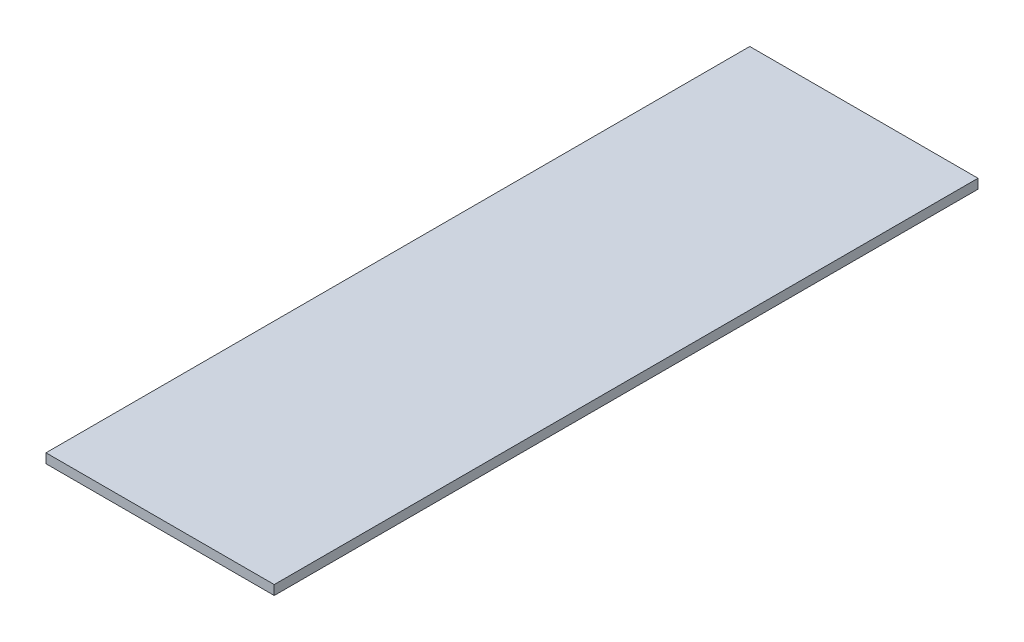
ISO-10303-21;
HEADER;
FILE_DESCRIPTION(('STEP AP214'),'2;1');
FILE_NAME('part.step','',(''),(''),'','','');
FILE_SCHEMA(('AUTOMOTIVE_DESIGN { 1 0 10303 214 1 1 1 1 }'));
ENDSEC;
DATA;
#1=APPLICATION_CONTEXT('core data for automotive mechanical design processes');
#2=APPLICATION_PROTOCOL_DEFINITION('international standard','automotive_design',2000,#1);
#3=PRODUCT_CONTEXT('',#1,'mechanical');
#4=PRODUCT('Part','Part','',(#3));
#5=PRODUCT_RELATED_PRODUCT_CATEGORY('part','',(#4));
#6=PRODUCT_DEFINITION_FORMATION('','',#4);
#7=PRODUCT_DEFINITION_CONTEXT('part definition',#1,'design');
#8=PRODUCT_DEFINITION('design','',#6,#7);
#9=PRODUCT_DEFINITION_SHAPE('','',#8);
#10=(LENGTH_UNIT() NAMED_UNIT(*) SI_UNIT(.MILLI.,.METRE.));
#11=(NAMED_UNIT(*) PLANE_ANGLE_UNIT() SI_UNIT($,.RADIAN.));
#12=(NAMED_UNIT(*) SI_UNIT($,.STERADIAN.) SOLID_ANGLE_UNIT());
#13=UNCERTAINTY_MEASURE_WITH_UNIT(LENGTH_MEASURE(1.E-05),#10,'distance_accuracy_value','');
#14=(GEOMETRIC_REPRESENTATION_CONTEXT(3) GLOBAL_UNCERTAINTY_ASSIGNED_CONTEXT((#13)) GLOBAL_UNIT_ASSIGNED_CONTEXT((#10,
#11,#12)) REPRESENTATION_CONTEXT('',''));
#15=CARTESIAN_POINT('',(0.,0.,0.));
#16=DIRECTION('',(0.,0.,1.));
#17=DIRECTION('',(1.,0.,0.));
#18=AXIS2_PLACEMENT_3D('',#15,#16,#17);
#19=CARTESIAN_POINT('',(0.,5.,0.));
#20=DIRECTION('',(1.,0.,0.));
#21=DIRECTION('',(0.,0.,-1.));
#22=AXIS2_PLACEMENT_3D('',#19,#20,#21);
#23=PLANE('',#22);
#24=DIRECTION('',(0.,0.,1.));
#25=VECTOR('',#24,1.);
#26=CARTESIAN_POINT('',(0.,0.,0.));
#27=LINE('',#26,#25);
#28=CARTESIAN_POINT('',(0.,0.,-370.));
#29=VERTEX_POINT('',#28);
#30=CARTESIAN_POINT('',(0.,0.,0.));
#31=VERTEX_POINT('',#30);
#32=EDGE_CURVE('E96',#29,#31,#27,.T.);
#33=ORIENTED_EDGE('',*,*,#32,.T.);
#34=DIRECTION('',(0.,-1.,0.));
#35=VECTOR('',#34,1.);
#36=CARTESIAN_POINT('',(0.,5.,0.));
#37=LINE('',#36,#35);
#38=CARTESIAN_POINT('',(0.,5.,0.));
#39=VERTEX_POINT('',#38);
#40=EDGE_CURVE('E11',#39,#31,#37,.T.);
#41=ORIENTED_EDGE('',*,*,#40,.F.);
#42=DIRECTION('',(0.,0.,1.));
#43=VECTOR('',#42,1.);
#44=CARTESIAN_POINT('',(0.,5.,0.));
#45=LINE('',#44,#43);
#46=CARTESIAN_POINT('',(0.,5.,-370.));
#47=VERTEX_POINT('',#46);
#48=EDGE_CURVE('E84',#47,#39,#45,.T.);
#49=ORIENTED_EDGE('',*,*,#48,.F.);
#50=DIRECTION('',(0.,-1.,0.));
#51=VECTOR('',#50,1.);
#52=CARTESIAN_POINT('',(0.,5.,-370.));
#53=LINE('',#52,#51);
#54=EDGE_CURVE('E92',#47,#29,#53,.T.);
#55=ORIENTED_EDGE('',*,*,#54,.T.);
#56=EDGE_LOOP('',(#33,#41,#49,#55));
#57=FACE_BOUND('',#56,.T.);
#58=ADVANCED_FACE('F33',(#57),#23,.F.);
#59=CARTESIAN_POINT('',(0.,5.,0.));
#60=DIRECTION('',(0.,0.,-1.));
#61=DIRECTION('',(-1.,0.,0.));
#62=AXIS2_PLACEMENT_3D('',#59,#60,#61);
#63=PLANE('',#62);
#64=DIRECTION('',(1.,0.,0.));
#65=VECTOR('',#64,1.);
#66=CARTESIAN_POINT('',(0.,0.,0.));
#67=LINE('',#66,#65);
#68=CARTESIAN_POINT('',(120.,0.,0.));
#69=VERTEX_POINT('',#68);
#70=EDGE_CURVE('E88',#31,#69,#67,.T.);
#71=ORIENTED_EDGE('',*,*,#70,.T.);
#72=DIRECTION('',(0.,-1.,0.));
#73=VECTOR('',#72,1.);
#74=CARTESIAN_POINT('',(120.,5.,0.));
#75=LINE('',#74,#73);
#76=CARTESIAN_POINT('',(120.,5.,0.));
#77=VERTEX_POINT('',#76);
#78=EDGE_CURVE('E41',#77,#69,#75,.T.);
#79=ORIENTED_EDGE('',*,*,#78,.F.);
#80=DIRECTION('',(1.,0.,0.));
#81=VECTOR('',#80,1.);
#82=CARTESIAN_POINT('',(0.,5.,0.));
#83=LINE('',#82,#81);
#84=EDGE_CURVE('E79',#39,#77,#83,.T.);
#85=ORIENTED_EDGE('',*,*,#84,.F.);
#86=ORIENTED_EDGE('',*,*,#40,.T.);
#87=EDGE_LOOP('',(#71,#79,#85,#86));
#88=FACE_BOUND('',#87,.T.);
#89=ADVANCED_FACE('F87',(#88),#63,.F.);
#90=CARTESIAN_POINT('',(120.,5.,0.));
#91=DIRECTION('',(-1.,0.,0.));
#92=DIRECTION('',(0.,0.,1.));
#93=AXIS2_PLACEMENT_3D('',#90,#91,#92);
#94=PLANE('',#93);
#95=DIRECTION('',(0.,0.,-1.));
#96=VECTOR('',#95,1.);
#97=CARTESIAN_POINT('',(120.,0.,0.));
#98=LINE('',#97,#96);
#99=CARTESIAN_POINT('',(120.,0.,-370.));
#100=VERTEX_POINT('',#99);
#101=EDGE_CURVE('E66',#69,#100,#98,.T.);
#102=ORIENTED_EDGE('',*,*,#101,.T.);
#103=DIRECTION('',(0.,-1.,0.));
#104=VECTOR('',#103,1.);
#105=CARTESIAN_POINT('',(120.,5.,-370.));
#106=LINE('',#105,#104);
#107=CARTESIAN_POINT('',(120.,5.,-370.));
#108=VERTEX_POINT('',#107);
#109=EDGE_CURVE('E89',#108,#100,#106,.T.);
#110=ORIENTED_EDGE('',*,*,#109,.F.);
#111=DIRECTION('',(0.,0.,-1.));
#112=VECTOR('',#111,1.);
#113=CARTESIAN_POINT('',(120.,5.,0.));
#114=LINE('',#113,#112);
#115=EDGE_CURVE('E82',#77,#108,#114,.T.);
#116=ORIENTED_EDGE('',*,*,#115,.F.);
#117=ORIENTED_EDGE('',*,*,#78,.T.);
#118=EDGE_LOOP('',(#102,#110,#116,#117));
#119=FACE_BOUND('',#118,.T.);
#120=ADVANCED_FACE('F90',(#119),#94,.F.);
#121=CARTESIAN_POINT('',(0.,5.,-370.));
#122=DIRECTION('',(0.,0.,1.));
#123=DIRECTION('',(1.,0.,0.));
#124=AXIS2_PLACEMENT_3D('',#121,#122,#123);
#125=PLANE('',#124);
#126=DIRECTION('',(-1.,0.,0.));
#127=VECTOR('',#126,1.);
#128=CARTESIAN_POINT('',(0.,0.,-370.));
#129=LINE('',#128,#127);
#130=EDGE_CURVE('E72',#100,#29,#129,.T.);
#131=ORIENTED_EDGE('',*,*,#130,.T.);
#132=ORIENTED_EDGE('',*,*,#54,.F.);
#133=DIRECTION('',(-1.,0.,0.));
#134=VECTOR('',#133,1.);
#135=CARTESIAN_POINT('',(0.,5.,-370.));
#136=LINE('',#135,#134);
#137=EDGE_CURVE('E49',#108,#47,#136,.T.);
#138=ORIENTED_EDGE('',*,*,#137,.F.);
#139=ORIENTED_EDGE('',*,*,#109,.T.);
#140=EDGE_LOOP('',(#131,#132,#138,#139));
#141=FACE_BOUND('',#140,.T.);
#142=ADVANCED_FACE('F103',(#141),#125,.F.);
#143=CARTESIAN_POINT('',(0.,5.,0.));
#144=DIRECTION('',(0.,-1.,0.));
#145=DIRECTION('',(0.,0.,-1.));
#146=AXIS2_PLACEMENT_3D('',#143,#144,#145);
#147=PLANE('',#146);
#148=ORIENTED_EDGE('',*,*,#48,.T.);
#149=ORIENTED_EDGE('',*,*,#84,.T.);
#150=ORIENTED_EDGE('',*,*,#115,.T.);
#151=ORIENTED_EDGE('',*,*,#137,.T.);
#152=EDGE_LOOP('',(#148,#149,#150,#151));
#153=FACE_BOUND('',#152,.T.);
#154=ADVANCED_FACE('F80',(#153),#147,.F.);
#155=CARTESIAN_POINT('',(0.,0.,0.));
#156=DIRECTION('',(0.,-1.,0.));
#157=DIRECTION('',(0.,0.,-1.));
#158=AXIS2_PLACEMENT_3D('',#155,#156,#157);
#159=PLANE('',#158);
#160=ORIENTED_EDGE('',*,*,#32,.F.);
#161=ORIENTED_EDGE('',*,*,#130,.F.);
#162=ORIENTED_EDGE('',*,*,#101,.F.);
#163=ORIENTED_EDGE('',*,*,#70,.F.);
#164=EDGE_LOOP('',(#160,#161,#162,#163));
#165=FACE_BOUND('',#164,.T.);
#166=ADVANCED_FACE('F106',(#165),#159,.T.);
#167=CLOSED_SHELL('',(#58,#89,#120,#142,#154,#166));
#168=MANIFOLD_SOLID_BREP('B2',#167);
#169=ADVANCED_BREP_SHAPE_REPRESENTATION('',(#18,#168),#14);
#170=SHAPE_DEFINITION_REPRESENTATION(#9,#169);
ENDSEC;
END-ISO-10303-21;
